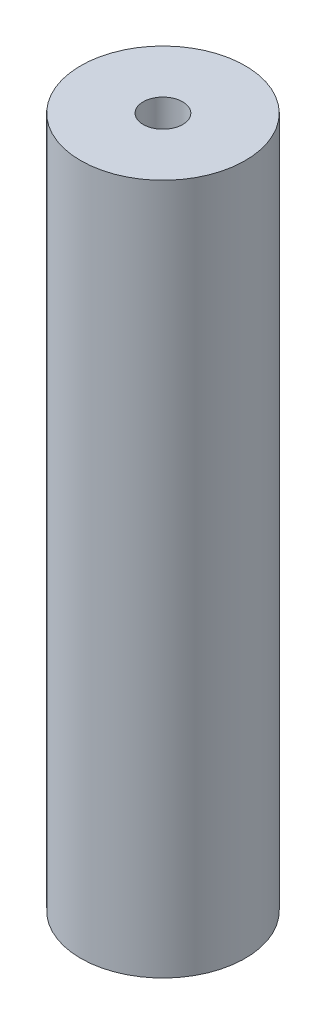
ISO-10303-21;
HEADER;
FILE_DESCRIPTION(('STEP AP214'),'2;1');
FILE_NAME('part.step','',(''),(''),'','','');
FILE_SCHEMA(('AUTOMOTIVE_DESIGN { 1 0 10303 214 1 1 1 1 }'));
ENDSEC;
DATA;
#1=APPLICATION_CONTEXT('core data for automotive mechanical design processes');
#2=APPLICATION_PROTOCOL_DEFINITION('international standard','automotive_design',2000,#1);
#3=PRODUCT_CONTEXT('',#1,'mechanical');
#4=PRODUCT('Part','Part','',(#3));
#5=PRODUCT_RELATED_PRODUCT_CATEGORY('part','',(#4));
#6=PRODUCT_DEFINITION_FORMATION('','',#4);
#7=PRODUCT_DEFINITION_CONTEXT('part definition',#1,'design');
#8=PRODUCT_DEFINITION('design','',#6,#7);
#9=PRODUCT_DEFINITION_SHAPE('','',#8);
#10=(LENGTH_UNIT() NAMED_UNIT(*) SI_UNIT(.MILLI.,.METRE.));
#11=(NAMED_UNIT(*) PLANE_ANGLE_UNIT() SI_UNIT($,.RADIAN.));
#12=(NAMED_UNIT(*) SI_UNIT($,.STERADIAN.) SOLID_ANGLE_UNIT());
#13=UNCERTAINTY_MEASURE_WITH_UNIT(LENGTH_MEASURE(1.E-05),#10,'distance_accuracy_value','');
#14=(GEOMETRIC_REPRESENTATION_CONTEXT(3) GLOBAL_UNCERTAINTY_ASSIGNED_CONTEXT((#13)) GLOBAL_UNIT_ASSIGNED_CONTEXT((#10,
#11,#12)) REPRESENTATION_CONTEXT('',''));
#15=CARTESIAN_POINT('',(0.,0.,0.));
#16=DIRECTION('',(0.,0.,1.));
#17=DIRECTION('',(1.,0.,0.));
#18=AXIS2_PLACEMENT_3D('',#15,#16,#17);
#19=CARTESIAN_POINT('',(0.,105.,0.));
#20=DIRECTION('',(0.,1.,0.));
#21=DIRECTION('',(0.,0.,1.));
#22=AXIS2_PLACEMENT_3D('',#19,#20,#21);
#23=PLANE('',#22);
#24=CARTESIAN_POINT('',(0.,105.,0.));
#25=DIRECTION('',(0.,1.,0.));
#26=DIRECTION('',(0.,0.,1.));
#27=AXIS2_PLACEMENT_3D('',#24,#25,#26);
#28=CIRCLE('',#27,12.5);
#29=CARTESIAN_POINT('',(0.,105.,12.5));
#30=VERTEX_POINT('',#29);
#31=EDGE_CURVE('E10',#30,#30,#28,.T.);
#32=ORIENTED_EDGE('',*,*,#31,.T.);
#33=EDGE_LOOP('',(#32));
#34=FACE_BOUND('',#33,.T.);
#35=CARTESIAN_POINT('',(0.,105.,0.));
#36=DIRECTION('',(0.,1.,0.));
#37=DIRECTION('',(0.,0.,1.));
#38=AXIS2_PLACEMENT_3D('',#35,#36,#37);
#39=CIRCLE('',#38,3.);
#40=CARTESIAN_POINT('',(0.,105.,3.));
#41=VERTEX_POINT('',#40);
#42=EDGE_CURVE('E52',#41,#41,#39,.T.);
#43=ORIENTED_EDGE('',*,*,#42,.F.);
#44=EDGE_LOOP('',(#43));
#45=FACE_BOUND('',#44,.T.);
#46=ADVANCED_FACE('F39',(#34,#45),#23,.T.);
#47=CARTESIAN_POINT('',(0.,0.,0.));
#48=DIRECTION('',(0.,1.,0.));
#49=DIRECTION('',(0.,0.,1.));
#50=AXIS2_PLACEMENT_3D('',#47,#48,#49);
#51=PLANE('',#50);
#52=CARTESIAN_POINT('',(0.,0.,0.));
#53=DIRECTION('',(0.,1.,0.));
#54=DIRECTION('',(0.,0.,1.));
#55=AXIS2_PLACEMENT_3D('',#52,#53,#54);
#56=CIRCLE('',#55,12.5);
#57=CARTESIAN_POINT('',(0.,0.,12.5));
#58=VERTEX_POINT('',#57);
#59=EDGE_CURVE('E43',#58,#58,#56,.T.);
#60=ORIENTED_EDGE('',*,*,#59,.F.);
#61=EDGE_LOOP('',(#60));
#62=FACE_BOUND('',#61,.T.);
#63=CARTESIAN_POINT('',(0.,0.,0.));
#64=DIRECTION('',(0.,1.,0.));
#65=DIRECTION('',(0.,0.,1.));
#66=AXIS2_PLACEMENT_3D('',#63,#64,#65);
#67=CIRCLE('',#66,3.);
#68=CARTESIAN_POINT('',(0.,0.,3.));
#69=VERTEX_POINT('',#68);
#70=EDGE_CURVE('E54',#69,#69,#67,.T.);
#71=ORIENTED_EDGE('',*,*,#70,.T.);
#72=EDGE_LOOP('',(#71));
#73=FACE_BOUND('',#72,.T.);
#74=ADVANCED_FACE('F66',(#62,#73),#51,.F.);
#75=CARTESIAN_POINT('',(0.,105.,0.));
#76=DIRECTION('',(0.,-1.,0.));
#77=DIRECTION('',(0.,0.,-1.));
#78=AXIS2_PLACEMENT_3D('',#75,#76,#77);
#79=CYLINDRICAL_SURFACE('',#78,12.5);
#80=ORIENTED_EDGE('',*,*,#31,.F.);
#81=EDGE_LOOP('',(#80));
#82=FACE_BOUND('',#81,.T.);
#83=ORIENTED_EDGE('',*,*,#59,.T.);
#84=EDGE_LOOP('',(#83));
#85=FACE_BOUND('',#84,.T.);
#86=ADVANCED_FACE('F41',(#82,#85),#79,.T.);
#87=CARTESIAN_POINT('',(0.,105.,0.));
#88=DIRECTION('',(0.,-1.,0.));
#89=DIRECTION('',(0.,0.,-1.));
#90=AXIS2_PLACEMENT_3D('',#87,#88,#89);
#91=CYLINDRICAL_SURFACE('',#90,3.);
#92=ORIENTED_EDGE('',*,*,#42,.T.);
#93=EDGE_LOOP('',(#92));
#94=FACE_BOUND('',#93,.T.);
#95=ORIENTED_EDGE('',*,*,#70,.F.);
#96=EDGE_LOOP('',(#95));
#97=FACE_BOUND('',#96,.T.);
#98=ADVANCED_FACE('F62',(#94,#97),#91,.F.);
#99=CLOSED_SHELL('',(#46,#74,#86,#98));
#100=MANIFOLD_SOLID_BREP('B2',#99);
#101=ADVANCED_BREP_SHAPE_REPRESENTATION('',(#18,#100),#14);
#102=SHAPE_DEFINITION_REPRESENTATION(#9,#101);
ENDSEC;
END-ISO-10303-21;
